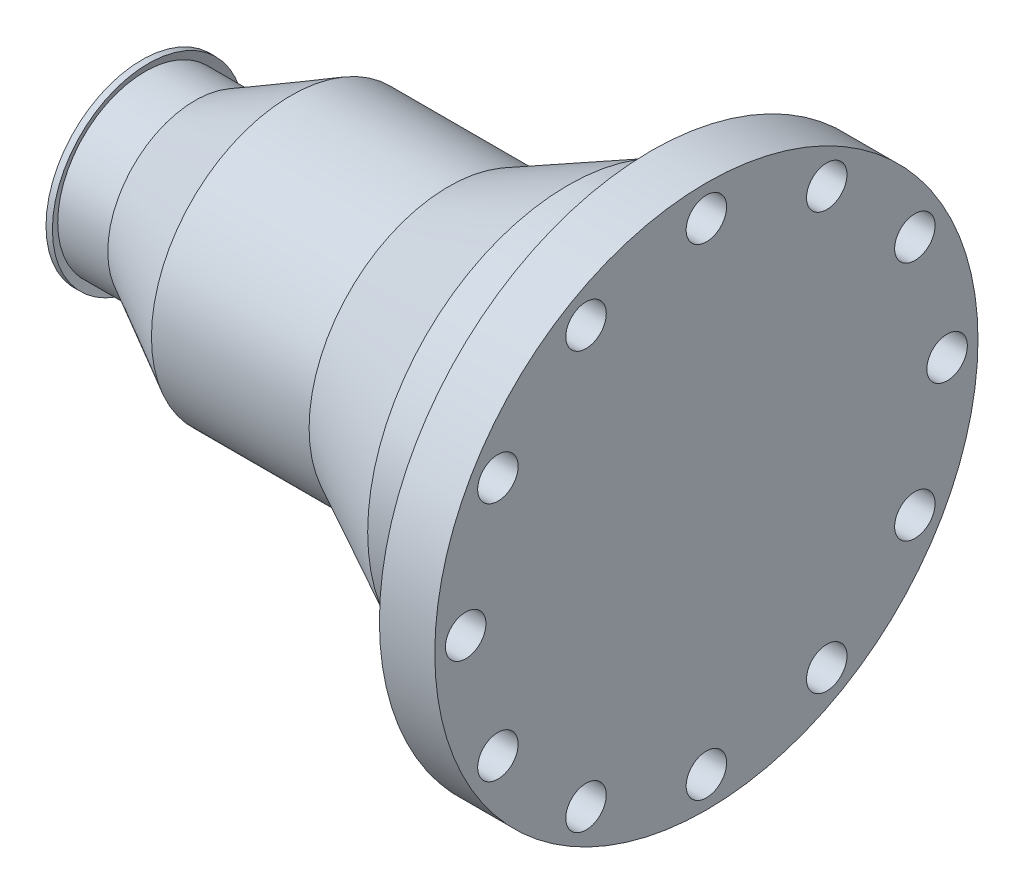
ISO-10303-21;
HEADER;
FILE_DESCRIPTION(('STEP AP214'),'2;1');
FILE_NAME('part.step','',(''),(''),'','','');
FILE_SCHEMA(('AUTOMOTIVE_DESIGN { 1 0 10303 214 1 1 1 1 }'));
ENDSEC;
DATA;
#1=APPLICATION_CONTEXT('core data for automotive mechanical design processes');
#2=APPLICATION_PROTOCOL_DEFINITION('international standard','automotive_design',2000,#1);
#3=PRODUCT_CONTEXT('',#1,'mechanical');
#4=PRODUCT('Part','Part','',(#3));
#5=PRODUCT_RELATED_PRODUCT_CATEGORY('part','',(#4));
#6=PRODUCT_DEFINITION_FORMATION('','',#4);
#7=PRODUCT_DEFINITION_CONTEXT('part definition',#1,'design');
#8=PRODUCT_DEFINITION('design','',#6,#7);
#9=PRODUCT_DEFINITION_SHAPE('','',#8);
#10=(LENGTH_UNIT() NAMED_UNIT(*) SI_UNIT(.MILLI.,.METRE.));
#11=(NAMED_UNIT(*) PLANE_ANGLE_UNIT() SI_UNIT($,.RADIAN.));
#12=(NAMED_UNIT(*) SI_UNIT($,.STERADIAN.) SOLID_ANGLE_UNIT());
#13=UNCERTAINTY_MEASURE_WITH_UNIT(LENGTH_MEASURE(1.E-05),#10,'distance_accuracy_value','');
#14=(GEOMETRIC_REPRESENTATION_CONTEXT(3) GLOBAL_UNCERTAINTY_ASSIGNED_CONTEXT((#13)) GLOBAL_UNIT_ASSIGNED_CONTEXT((#10,
#11,#12)) REPRESENTATION_CONTEXT('',''));
#15=CARTESIAN_POINT('',(0.,0.,0.));
#16=DIRECTION('',(0.,0.,1.));
#17=DIRECTION('',(1.,0.,0.));
#18=AXIS2_PLACEMENT_3D('',#15,#16,#17);
#19=CARTESIAN_POINT('',(0.,0.,0.));
#20=DIRECTION('',(1.,0.,0.));
#21=DIRECTION('',(0.,0.,-1.));
#22=AXIS2_PLACEMENT_3D('',#19,#20,#21);
#23=PLANE('',#22);
#24=CARTESIAN_POINT('',(0.,0.,0.));
#25=DIRECTION('',(-1.,0.,0.));
#26=DIRECTION('',(0.,0.,1.));
#27=AXIS2_PLACEMENT_3D('',#24,#25,#26);
#28=CIRCLE('',#27,31.);
#29=CARTESIAN_POINT('',(0.,0.,31.));
#30=VERTEX_POINT('',#29);
#31=EDGE_CURVE('E80',#30,#30,#28,.T.);
#32=ORIENTED_EDGE('',*,*,#31,.F.);
#33=EDGE_LOOP('',(#32));
#34=FACE_BOUND('',#33,.T.);
#35=CARTESIAN_POINT('',(0.,0.,0.));
#36=DIRECTION('',(-1.,0.,0.));
#37=DIRECTION('',(0.,0.,1.));
#38=AXIS2_PLACEMENT_3D('',#35,#36,#37);
#39=CIRCLE('',#38,45.);
#40=CARTESIAN_POINT('',(0.,0.,45.));
#41=VERTEX_POINT('',#40);
#42=EDGE_CURVE('E10',#41,#41,#39,.T.);
#43=ORIENTED_EDGE('',*,*,#42,.T.);
#44=EDGE_LOOP('',(#43));
#45=FACE_BOUND('',#44,.T.);
#46=ADVANCED_FACE('F37',(#34,#45),#23,.F.);
#47=CARTESIAN_POINT('',(0.,0.,0.));
#48=DIRECTION('',(-1.,0.,0.));
#49=DIRECTION('',(0.,0.,1.));
#50=AXIS2_PLACEMENT_3D('',#47,#48,#49);
#51=CYLINDRICAL_SURFACE('',#50,45.);
#52=ORIENTED_EDGE('',*,*,#42,.F.);
#53=EDGE_LOOP('',(#52));
#54=FACE_BOUND('',#53,.T.);
#55=CARTESIAN_POINT('',(3.,0.,0.));
#56=DIRECTION('',(-1.,0.,0.));
#57=DIRECTION('',(0.,0.,1.));
#58=AXIS2_PLACEMENT_3D('',#55,#56,#57);
#59=CIRCLE('',#58,45.);
#60=CARTESIAN_POINT('',(3.,0.,45.));
#61=VERTEX_POINT('',#60);
#62=EDGE_CURVE('E43',#61,#61,#59,.T.);
#63=ORIENTED_EDGE('',*,*,#62,.T.);
#64=EDGE_LOOP('',(#63));
#65=FACE_BOUND('',#64,.T.);
#66=ADVANCED_FACE('F205',(#54,#65),#51,.T.);
#67=CARTESIAN_POINT('',(1.5,0.,0.));
#68=DIRECTION('',(1.,0.,0.));
#69=DIRECTION('',(0.,0.,-1.));
#70=AXIS2_PLACEMENT_3D('',#67,#68,#69);
#71=CONICAL_SURFACE('',#70,41.,1.21202565652432);
#72=ORIENTED_EDGE('',*,*,#62,.F.);
#73=EDGE_LOOP('',(#72));
#74=FACE_BOUND('',#73,.T.);
#75=CARTESIAN_POINT('',(1.5,0.,0.));
#76=DIRECTION('',(-1.,0.,0.));
#77=DIRECTION('',(0.,0.,1.));
#78=AXIS2_PLACEMENT_3D('',#75,#76,#77);
#79=CIRCLE('',#78,41.);
#80=CARTESIAN_POINT('',(1.5,0.,41.));
#81=VERTEX_POINT('',#80);
#82=EDGE_CURVE('E47',#81,#81,#79,.T.);
#83=ORIENTED_EDGE('',*,*,#82,.T.);
#84=EDGE_LOOP('',(#83));
#85=FACE_BOUND('',#84,.T.);
#86=ADVANCED_FACE('F211',(#74,#85),#71,.F.);
#87=CARTESIAN_POINT('',(0.,0.,0.));
#88=DIRECTION('',(-1.,0.,0.));
#89=DIRECTION('',(0.,0.,1.));
#90=AXIS2_PLACEMENT_3D('',#87,#88,#89);
#91=CYLINDRICAL_SURFACE('',#90,41.);
#92=ORIENTED_EDGE('',*,*,#82,.F.);
#93=EDGE_LOOP('',(#92));
#94=FACE_BOUND('',#93,.T.);
#95=CARTESIAN_POINT('',(25.,0.,0.));
#96=DIRECTION('',(-1.,0.,0.));
#97=DIRECTION('',(0.,0.,1.));
#98=AXIS2_PLACEMENT_3D('',#95,#96,#97);
#99=CIRCLE('',#98,41.);
#100=CARTESIAN_POINT('',(25.,0.,41.));
#101=VERTEX_POINT('',#100);
#102=EDGE_CURVE('E51',#101,#101,#99,.T.);
#103=ORIENTED_EDGE('',*,*,#102,.T.);
#104=EDGE_LOOP('',(#103));
#105=FACE_BOUND('',#104,.T.);
#106=ADVANCED_FACE('F409',(#94,#105),#91,.T.);
#107=CARTESIAN_POINT('',(70.,0.,0.));
#108=DIRECTION('',(1.,0.,0.));
#109=DIRECTION('',(0.,0.,-1.));
#110=AXIS2_PLACEMENT_3D('',#107,#108,#109);
#111=CONICAL_SURFACE('',#110,65.5,0.498567905638218);
#112=ORIENTED_EDGE('',*,*,#102,.F.);
#113=EDGE_LOOP('',(#112));
#114=FACE_BOUND('',#113,.T.);
#115=CARTESIAN_POINT('',(70.,0.,0.));
#116=DIRECTION('',(-1.,0.,0.));
#117=DIRECTION('',(0.,0.,1.));
#118=AXIS2_PLACEMENT_3D('',#115,#116,#117);
#119=CIRCLE('',#118,65.5);
#120=CARTESIAN_POINT('',(70.,0.,65.5));
#121=VERTEX_POINT('',#120);
#122=EDGE_CURVE('E56',#121,#121,#119,.T.);
#123=ORIENTED_EDGE('',*,*,#122,.T.);
#124=EDGE_LOOP('',(#123));
#125=FACE_BOUND('',#124,.T.);
#126=ADVANCED_FACE('F400',(#114,#125),#111,.T.);
#127=CARTESIAN_POINT('',(0.,0.,0.));
#128=DIRECTION('',(-1.,0.,0.));
#129=DIRECTION('',(0.,0.,1.));
#130=AXIS2_PLACEMENT_3D('',#127,#128,#129);
#131=CYLINDRICAL_SURFACE('',#130,65.5);
#132=ORIENTED_EDGE('',*,*,#122,.F.);
#133=EDGE_LOOP('',(#132));
#134=FACE_BOUND('',#133,.T.);
#135=CARTESIAN_POINT('',(144.,0.,0.));
#136=DIRECTION('',(-1.,0.,0.));
#137=DIRECTION('',(0.,0.,1.));
#138=AXIS2_PLACEMENT_3D('',#135,#136,#137);
#139=CIRCLE('',#138,65.5);
#140=CARTESIAN_POINT('',(144.,0.,65.5));
#141=VERTEX_POINT('',#140);
#142=EDGE_CURVE('E59',#141,#141,#139,.T.);
#143=ORIENTED_EDGE('',*,*,#142,.T.);
#144=EDGE_LOOP('',(#143));
#145=FACE_BOUND('',#144,.T.);
#146=ADVANCED_FACE('F391',(#134,#145),#131,.T.);
#147=CARTESIAN_POINT('',(200.,0.,0.));
#148=DIRECTION('',(1.,0.,0.));
#149=DIRECTION('',(0.,0.,-1.));
#150=AXIS2_PLACEMENT_3D('',#147,#148,#149);
#151=CONICAL_SURFACE('',#150,94.,0.470764926542016);
#152=ORIENTED_EDGE('',*,*,#142,.F.);
#153=EDGE_LOOP('',(#152));
#154=FACE_BOUND('',#153,.T.);
#155=CARTESIAN_POINT('',(200.,0.,0.));
#156=DIRECTION('',(-1.,0.,0.));
#157=DIRECTION('',(0.,0.,1.));
#158=AXIS2_PLACEMENT_3D('',#155,#156,#157);
#159=CIRCLE('',#158,94.);
#160=CARTESIAN_POINT('',(200.,0.,94.));
#161=VERTEX_POINT('',#160);
#162=EDGE_CURVE('E62',#161,#161,#159,.T.);
#163=ORIENTED_EDGE('',*,*,#162,.T.);
#164=EDGE_LOOP('',(#163));
#165=FACE_BOUND('',#164,.T.);
#166=ADVANCED_FACE('F382',(#154,#165),#151,.T.);
#167=CARTESIAN_POINT('',(0.,0.,0.));
#168=DIRECTION('',(-1.,0.,0.));
#169=DIRECTION('',(0.,0.,1.));
#170=AXIS2_PLACEMENT_3D('',#167,#168,#169);
#171=CYLINDRICAL_SURFACE('',#170,94.);
#172=ORIENTED_EDGE('',*,*,#162,.F.);
#173=EDGE_LOOP('',(#172));
#174=FACE_BOUND('',#173,.T.);
#175=CARTESIAN_POINT('',(220.,0.,0.));
#176=DIRECTION('',(-1.,0.,0.));
#177=DIRECTION('',(0.,0.,1.));
#178=AXIS2_PLACEMENT_3D('',#175,#176,#177);
#179=CIRCLE('',#178,94.);
#180=CARTESIAN_POINT('',(220.,0.,94.));
#181=VERTEX_POINT('',#180);
#182=EDGE_CURVE('E65',#181,#181,#179,.T.);
#183=ORIENTED_EDGE('',*,*,#182,.T.);
#184=EDGE_LOOP('',(#183));
#185=FACE_BOUND('',#184,.T.);
#186=ADVANCED_FACE('F373',(#174,#185),#171,.T.);
#187=CARTESIAN_POINT('',(220.,94.,0.));
#188=DIRECTION('',(1.,0.,0.));
#189=DIRECTION('',(0.,0.,-1.));
#190=AXIS2_PLACEMENT_3D('',#187,#188,#189);
#191=PLANE('',#190);
#192=ORIENTED_EDGE('',*,*,#182,.F.);
#193=EDGE_LOOP('',(#192));
#194=FACE_BOUND('',#193,.T.);
#195=CARTESIAN_POINT('',(220.,0.,0.));
#196=DIRECTION('',(-1.,0.,0.));
#197=DIRECTION('',(0.,0.,1.));
#198=AXIS2_PLACEMENT_3D('',#195,#196,#197);
#199=CIRCLE('',#198,95.);
#200=CARTESIAN_POINT('',(220.,0.,95.));
#201=VERTEX_POINT('',#200);
#202=EDGE_CURVE('E68',#201,#201,#199,.T.);
#203=ORIENTED_EDGE('',*,*,#202,.T.);
#204=EDGE_LOOP('',(#203));
#205=FACE_BOUND('',#204,.T.);
#206=ADVANCED_FACE('F364',(#194,#205),#191,.F.);
#207=CARTESIAN_POINT('',(0.,0.,0.));
#208=DIRECTION('',(-1.,0.,0.));
#209=DIRECTION('',(0.,0.,1.));
#210=AXIS2_PLACEMENT_3D('',#207,#208,#209);
#211=CYLINDRICAL_SURFACE('',#210,95.);
#212=ORIENTED_EDGE('',*,*,#202,.F.);
#213=EDGE_LOOP('',(#212));
#214=FACE_BOUND('',#213,.T.);
#215=CARTESIAN_POINT('',(239.,0.,0.));
#216=DIRECTION('',(-1.,0.,0.));
#217=DIRECTION('',(0.,0.,1.));
#218=AXIS2_PLACEMENT_3D('',#215,#216,#217);
#219=CIRCLE('',#218,95.);
#220=CARTESIAN_POINT('',(239.,0.,95.));
#221=VERTEX_POINT('',#220);
#222=EDGE_CURVE('E71',#221,#221,#219,.T.);
#223=ORIENTED_EDGE('',*,*,#222,.T.);
#224=EDGE_LOOP('',(#223));
#225=FACE_BOUND('',#224,.T.);
#226=ADVANCED_FACE('F201',(#214,#225),#211,.T.);
#227=CARTESIAN_POINT('',(239.,100.,0.));
#228=DIRECTION('',(1.,0.,0.));
#229=DIRECTION('',(0.,0.,-1.));
#230=AXIS2_PLACEMENT_3D('',#227,#228,#229);
#231=PLANE('',#230);
#232=CARTESIAN_POINT('',(239.,97.8608706276416,-56.5));
#233=DIRECTION('',(1.,0.,0.));
#234=DIRECTION('',(0.,0.,-1.));
#235=AXIS2_PLACEMENT_3D('',#232,#233,#234);
#236=CIRCLE('',#235,9.50000000000001);
#237=CARTESIAN_POINT('',(239.,97.8608706276416,-66.));
#238=VERTEX_POINT('',#237);
#239=EDGE_CURVE('E152',#238,#238,#236,.F.);
#240=ORIENTED_EDGE('',*,*,#239,.F.);
#241=EDGE_LOOP('',(#240));
#242=FACE_BOUND('',#241,.T.);
#243=CARTESIAN_POINT('',(239.,56.4999999999999,-97.8608706276416));
#244=DIRECTION('',(1.,0.,0.));
#245=DIRECTION('',(0.,0.,-1.));
#246=AXIS2_PLACEMENT_3D('',#243,#244,#245);
#247=CIRCLE('',#246,9.5);
#248=CARTESIAN_POINT('',(239.,56.4999999999999,-107.360870627642));
#249=VERTEX_POINT('',#248);
#250=EDGE_CURVE('E146',#249,#249,#247,.F.);
#251=ORIENTED_EDGE('',*,*,#250,.F.);
#252=EDGE_LOOP('',(#251));
#253=FACE_BOUND('',#252,.T.);
#254=CARTESIAN_POINT('',(239.,0.,-113.));
#255=DIRECTION('',(1.,0.,0.));
#256=DIRECTION('',(0.,0.,-1.));
#257=AXIS2_PLACEMENT_3D('',#254,#255,#256);
#258=CIRCLE('',#257,9.49999999999999);
#259=CARTESIAN_POINT('',(239.,0.,-122.5));
#260=VERTEX_POINT('',#259);
#261=EDGE_CURVE('E140',#260,#260,#258,.F.);
#262=ORIENTED_EDGE('',*,*,#261,.F.);
#263=EDGE_LOOP('',(#262));
#264=FACE_BOUND('',#263,.T.);
#265=CARTESIAN_POINT('',(239.,-56.5,-97.8608706276415));
#266=DIRECTION('',(1.,0.,0.));
#267=DIRECTION('',(0.,0.,-1.));
#268=AXIS2_PLACEMENT_3D('',#265,#266,#267);
#269=CIRCLE('',#268,9.5);
#270=CARTESIAN_POINT('',(239.,-56.5,-107.360870627642));
#271=VERTEX_POINT('',#270);
#272=EDGE_CURVE('E134',#271,#271,#269,.F.);
#273=ORIENTED_EDGE('',*,*,#272,.F.);
#274=EDGE_LOOP('',(#273));
#275=FACE_BOUND('',#274,.T.);
#276=CARTESIAN_POINT('',(239.,-97.8608706276416,-56.5));
#277=DIRECTION('',(1.,0.,0.));
#278=DIRECTION('',(0.,0.,-1.));
#279=AXIS2_PLACEMENT_3D('',#276,#277,#278);
#280=CIRCLE('',#279,9.50000000000001);
#281=CARTESIAN_POINT('',(239.,-97.8608706276416,-66.));
#282=VERTEX_POINT('',#281);
#283=EDGE_CURVE('E128',#282,#282,#280,.F.);
#284=ORIENTED_EDGE('',*,*,#283,.F.);
#285=EDGE_LOOP('',(#284));
#286=FACE_BOUND('',#285,.T.);
#287=CARTESIAN_POINT('',(239.,-113.,0.));
#288=DIRECTION('',(1.,0.,0.));
#289=DIRECTION('',(0.,0.,-1.));
#290=AXIS2_PLACEMENT_3D('',#287,#288,#289);
#291=CIRCLE('',#290,9.49999999999998);
#292=CARTESIAN_POINT('',(239.,-113.,-9.49999999999998));
#293=VERTEX_POINT('',#292);
#294=EDGE_CURVE('E122',#293,#293,#291,.F.);
#295=ORIENTED_EDGE('',*,*,#294,.F.);
#296=EDGE_LOOP('',(#295));
#297=FACE_BOUND('',#296,.T.);
#298=CARTESIAN_POINT('',(239.,-97.8608706276415,56.5));
#299=DIRECTION('',(1.,0.,0.));
#300=DIRECTION('',(0.,0.,-1.));
#301=AXIS2_PLACEMENT_3D('',#298,#299,#300);
#302=CIRCLE('',#301,9.5);
#303=CARTESIAN_POINT('',(239.,-97.8608706276415,47.));
#304=VERTEX_POINT('',#303);
#305=EDGE_CURVE('E116',#304,#304,#302,.F.);
#306=ORIENTED_EDGE('',*,*,#305,.F.);
#307=EDGE_LOOP('',(#306));
#308=FACE_BOUND('',#307,.T.);
#309=CARTESIAN_POINT('',(239.,-56.5,97.8608706276416));
#310=DIRECTION('',(1.,0.,0.));
#311=DIRECTION('',(0.,0.,-1.));
#312=AXIS2_PLACEMENT_3D('',#309,#310,#311);
#313=CIRCLE('',#312,9.5);
#314=CARTESIAN_POINT('',(239.,-56.5,88.3608706276416));
#315=VERTEX_POINT('',#314);
#316=EDGE_CURVE('E110',#315,#315,#313,.F.);
#317=ORIENTED_EDGE('',*,*,#316,.F.);
#318=EDGE_LOOP('',(#317));
#319=FACE_BOUND('',#318,.T.);
#320=CARTESIAN_POINT('',(239.,0.,113.));
#321=DIRECTION('',(1.,0.,0.));
#322=DIRECTION('',(0.,0.,-1.));
#323=AXIS2_PLACEMENT_3D('',#320,#321,#322);
#324=CIRCLE('',#323,9.49999999999999);
#325=CARTESIAN_POINT('',(239.,0.,103.5));
#326=VERTEX_POINT('',#325);
#327=EDGE_CURVE('E104',#326,#326,#324,.F.);
#328=ORIENTED_EDGE('',*,*,#327,.F.);
#329=EDGE_LOOP('',(#328));
#330=FACE_BOUND('',#329,.T.);
#331=CARTESIAN_POINT('',(239.,56.5,97.8608706276416));
#332=DIRECTION('',(1.,0.,0.));
#333=DIRECTION('',(0.,0.,-1.));
#334=AXIS2_PLACEMENT_3D('',#331,#332,#333);
#335=CIRCLE('',#334,9.5);
#336=CARTESIAN_POINT('',(239.,56.5,88.3608706276416));
#337=VERTEX_POINT('',#336);
#338=EDGE_CURVE('E98',#337,#337,#335,.F.);
#339=ORIENTED_EDGE('',*,*,#338,.F.);
#340=EDGE_LOOP('',(#339));
#341=FACE_BOUND('',#340,.T.);
#342=CARTESIAN_POINT('',(239.,97.8608706276416,56.5));
#343=DIRECTION('',(1.,0.,0.));
#344=DIRECTION('',(0.,0.,-1.));
#345=AXIS2_PLACEMENT_3D('',#342,#343,#344);
#346=CIRCLE('',#345,9.5);
#347=CARTESIAN_POINT('',(239.,97.8608706276416,47.));
#348=VERTEX_POINT('',#347);
#349=EDGE_CURVE('E92',#348,#348,#346,.F.);
#350=ORIENTED_EDGE('',*,*,#349,.F.);
#351=EDGE_LOOP('',(#350));
#352=FACE_BOUND('',#351,.T.);
#353=CARTESIAN_POINT('',(239.,113.,0.));
#354=DIRECTION('',(1.,0.,0.));
#355=DIRECTION('',(0.,0.,-1.));
#356=AXIS2_PLACEMENT_3D('',#353,#354,#355);
#357=CIRCLE('',#356,9.50000000000001);
#358=CARTESIAN_POINT('',(239.,113.,-9.50000000000001));
#359=VERTEX_POINT('',#358);
#360=EDGE_CURVE('E86',#359,#359,#357,.F.);
#361=ORIENTED_EDGE('',*,*,#360,.F.);
#362=EDGE_LOOP('',(#361));
#363=FACE_BOUND('',#362,.T.);
#364=ORIENTED_EDGE('',*,*,#222,.F.);
#365=EDGE_LOOP('',(#364));
#366=FACE_BOUND('',#365,.T.);
#367=CARTESIAN_POINT('',(239.,0.,0.));
#368=DIRECTION('',(-1.,0.,0.));
#369=DIRECTION('',(0.,0.,1.));
#370=AXIS2_PLACEMENT_3D('',#367,#368,#369);
#371=CIRCLE('',#370,127.5);
#372=CARTESIAN_POINT('',(239.,0.,127.5));
#373=VERTEX_POINT('',#372);
#374=EDGE_CURVE('E74',#373,#373,#371,.T.);
#375=ORIENTED_EDGE('',*,*,#374,.T.);
#376=EDGE_LOOP('',(#375));
#377=FACE_BOUND('',#376,.T.);
#378=ADVANCED_FACE('F193',(#242,#253,#264,#275,#286,#297,#308,#319,#330,#341,#352,#363,#366,
#377),#231,.F.);
#379=CARTESIAN_POINT('',(0.,0.,0.));
#380=DIRECTION('',(-1.,0.,0.));
#381=DIRECTION('',(0.,0.,1.));
#382=AXIS2_PLACEMENT_3D('',#379,#380,#381);
#383=CYLINDRICAL_SURFACE('',#382,127.5);
#384=ORIENTED_EDGE('',*,*,#374,.F.);
#385=EDGE_LOOP('',(#384));
#386=FACE_BOUND('',#385,.T.);
#387=CARTESIAN_POINT('',(265.,0.,0.));
#388=DIRECTION('',(-1.,0.,0.));
#389=DIRECTION('',(0.,0.,1.));
#390=AXIS2_PLACEMENT_3D('',#387,#388,#389);
#391=CIRCLE('',#390,127.5);
#392=CARTESIAN_POINT('',(265.,0.,127.5));
#393=VERTEX_POINT('',#392);
#394=EDGE_CURVE('E77',#393,#393,#391,.T.);
#395=ORIENTED_EDGE('',*,*,#394,.T.);
#396=EDGE_LOOP('',(#395));
#397=FACE_BOUND('',#396,.T.);
#398=ADVANCED_FACE('F166',(#386,#397),#383,.T.);
#399=CARTESIAN_POINT('',(265.,127.5,0.));
#400=DIRECTION('',(-1.,0.,0.));
#401=DIRECTION('',(0.,0.,1.));
#402=AXIS2_PLACEMENT_3D('',#399,#400,#401);
#403=PLANE('',#402);
#404=CARTESIAN_POINT('',(265.,97.8608706276416,-56.5));
#405=DIRECTION('',(1.,0.,0.));
#406=DIRECTION('',(0.,0.,-1.));
#407=AXIS2_PLACEMENT_3D('',#404,#405,#406);
#408=CIRCLE('',#407,9.50000000000001);
#409=CARTESIAN_POINT('',(265.,97.8608706276416,-66.));
#410=VERTEX_POINT('',#409);
#411=EDGE_CURVE('E155',#410,#410,#408,.T.);
#412=ORIENTED_EDGE('',*,*,#411,.F.);
#413=EDGE_LOOP('',(#412));
#414=FACE_BOUND('',#413,.T.);
#415=CARTESIAN_POINT('',(265.,56.4999999999999,-97.8608706276416));
#416=DIRECTION('',(1.,0.,0.));
#417=DIRECTION('',(0.,0.,-1.));
#418=AXIS2_PLACEMENT_3D('',#415,#416,#417);
#419=CIRCLE('',#418,9.5);
#420=CARTESIAN_POINT('',(265.,56.4999999999999,-107.360870627642));
#421=VERTEX_POINT('',#420);
#422=EDGE_CURVE('E149',#421,#421,#419,.T.);
#423=ORIENTED_EDGE('',*,*,#422,.F.);
#424=EDGE_LOOP('',(#423));
#425=FACE_BOUND('',#424,.T.);
#426=CARTESIAN_POINT('',(265.,0.,-113.));
#427=DIRECTION('',(1.,0.,0.));
#428=DIRECTION('',(0.,0.,-1.));
#429=AXIS2_PLACEMENT_3D('',#426,#427,#428);
#430=CIRCLE('',#429,9.49999999999999);
#431=CARTESIAN_POINT('',(265.,0.,-122.5));
#432=VERTEX_POINT('',#431);
#433=EDGE_CURVE('E143',#432,#432,#430,.T.);
#434=ORIENTED_EDGE('',*,*,#433,.F.);
#435=EDGE_LOOP('',(#434));
#436=FACE_BOUND('',#435,.T.);
#437=CARTESIAN_POINT('',(265.,-56.5,-97.8608706276415));
#438=DIRECTION('',(1.,0.,0.));
#439=DIRECTION('',(0.,0.,-1.));
#440=AXIS2_PLACEMENT_3D('',#437,#438,#439);
#441=CIRCLE('',#440,9.5);
#442=CARTESIAN_POINT('',(265.,-56.5,-107.360870627642));
#443=VERTEX_POINT('',#442);
#444=EDGE_CURVE('E137',#443,#443,#441,.T.);
#445=ORIENTED_EDGE('',*,*,#444,.F.);
#446=EDGE_LOOP('',(#445));
#447=FACE_BOUND('',#446,.T.);
#448=CARTESIAN_POINT('',(265.,-97.8608706276416,-56.5));
#449=DIRECTION('',(1.,0.,0.));
#450=DIRECTION('',(0.,0.,-1.));
#451=AXIS2_PLACEMENT_3D('',#448,#449,#450);
#452=CIRCLE('',#451,9.50000000000001);
#453=CARTESIAN_POINT('',(265.,-97.8608706276416,-66.));
#454=VERTEX_POINT('',#453);
#455=EDGE_CURVE('E131',#454,#454,#452,.T.);
#456=ORIENTED_EDGE('',*,*,#455,.F.);
#457=EDGE_LOOP('',(#456));
#458=FACE_BOUND('',#457,.T.);
#459=CARTESIAN_POINT('',(265.,-113.,0.));
#460=DIRECTION('',(1.,0.,0.));
#461=DIRECTION('',(0.,0.,-1.));
#462=AXIS2_PLACEMENT_3D('',#459,#460,#461);
#463=CIRCLE('',#462,9.49999999999998);
#464=CARTESIAN_POINT('',(265.,-113.,-9.49999999999998));
#465=VERTEX_POINT('',#464);
#466=EDGE_CURVE('E125',#465,#465,#463,.T.);
#467=ORIENTED_EDGE('',*,*,#466,.F.);
#468=EDGE_LOOP('',(#467));
#469=FACE_BOUND('',#468,.T.);
#470=CARTESIAN_POINT('',(265.,-97.8608706276415,56.5));
#471=DIRECTION('',(1.,0.,0.));
#472=DIRECTION('',(0.,0.,-1.));
#473=AXIS2_PLACEMENT_3D('',#470,#471,#472);
#474=CIRCLE('',#473,9.5);
#475=CARTESIAN_POINT('',(265.,-97.8608706276415,47.));
#476=VERTEX_POINT('',#475);
#477=EDGE_CURVE('E119',#476,#476,#474,.T.);
#478=ORIENTED_EDGE('',*,*,#477,.F.);
#479=EDGE_LOOP('',(#478));
#480=FACE_BOUND('',#479,.T.);
#481=CARTESIAN_POINT('',(265.,-56.5,97.8608706276416));
#482=DIRECTION('',(1.,0.,0.));
#483=DIRECTION('',(0.,0.,-1.));
#484=AXIS2_PLACEMENT_3D('',#481,#482,#483);
#485=CIRCLE('',#484,9.5);
#486=CARTESIAN_POINT('',(265.,-56.5,88.3608706276416));
#487=VERTEX_POINT('',#486);
#488=EDGE_CURVE('E113',#487,#487,#485,.T.);
#489=ORIENTED_EDGE('',*,*,#488,.F.);
#490=EDGE_LOOP('',(#489));
#491=FACE_BOUND('',#490,.T.);
#492=CARTESIAN_POINT('',(265.,0.,113.));
#493=DIRECTION('',(1.,0.,0.));
#494=DIRECTION('',(0.,0.,-1.));
#495=AXIS2_PLACEMENT_3D('',#492,#493,#494);
#496=CIRCLE('',#495,9.49999999999999);
#497=CARTESIAN_POINT('',(265.,0.,103.5));
#498=VERTEX_POINT('',#497);
#499=EDGE_CURVE('E107',#498,#498,#496,.T.);
#500=ORIENTED_EDGE('',*,*,#499,.F.);
#501=EDGE_LOOP('',(#500));
#502=FACE_BOUND('',#501,.T.);
#503=CARTESIAN_POINT('',(265.,56.5,97.8608706276416));
#504=DIRECTION('',(1.,0.,0.));
#505=DIRECTION('',(0.,0.,-1.));
#506=AXIS2_PLACEMENT_3D('',#503,#504,#505);
#507=CIRCLE('',#506,9.5);
#508=CARTESIAN_POINT('',(265.,56.5,88.3608706276416));
#509=VERTEX_POINT('',#508);
#510=EDGE_CURVE('E101',#509,#509,#507,.T.);
#511=ORIENTED_EDGE('',*,*,#510,.F.);
#512=EDGE_LOOP('',(#511));
#513=FACE_BOUND('',#512,.T.);
#514=CARTESIAN_POINT('',(265.,97.8608706276416,56.5));
#515=DIRECTION('',(1.,0.,0.));
#516=DIRECTION('',(0.,0.,-1.));
#517=AXIS2_PLACEMENT_3D('',#514,#515,#516);
#518=CIRCLE('',#517,9.5);
#519=CARTESIAN_POINT('',(265.,97.8608706276416,47.));
#520=VERTEX_POINT('',#519);
#521=EDGE_CURVE('E95',#520,#520,#518,.T.);
#522=ORIENTED_EDGE('',*,*,#521,.F.);
#523=EDGE_LOOP('',(#522));
#524=FACE_BOUND('',#523,.T.);
#525=CARTESIAN_POINT('',(265.,113.,0.));
#526=DIRECTION('',(1.,0.,0.));
#527=DIRECTION('',(0.,0.,-1.));
#528=AXIS2_PLACEMENT_3D('',#525,#526,#527);
#529=CIRCLE('',#528,9.50000000000001);
#530=CARTESIAN_POINT('',(265.,113.,-9.50000000000001));
#531=VERTEX_POINT('',#530);
#532=EDGE_CURVE('E89',#531,#531,#529,.T.);
#533=ORIENTED_EDGE('',*,*,#532,.F.);
#534=EDGE_LOOP('',(#533));
#535=FACE_BOUND('',#534,.T.);
#536=ORIENTED_EDGE('',*,*,#394,.F.);
#537=EDGE_LOOP('',(#536));
#538=FACE_BOUND('',#537,.T.);
#539=ADVANCED_FACE('F162',(#414,#425,#436,#447,#458,#469,#480,#491,#502,#513,#524,#535,#538),
#403,.F.);
#540=CARTESIAN_POINT('',(0.,0.,0.));
#541=DIRECTION('',(-1.,0.,0.));
#542=DIRECTION('',(0.,0.,1.));
#543=AXIS2_PLACEMENT_3D('',#540,#541,#542);
#544=CYLINDRICAL_SURFACE('',#543,31.);
#545=ORIENTED_EDGE('',*,*,#31,.T.);
#546=EDGE_LOOP('',(#545));
#547=FACE_BOUND('',#546,.T.);
#548=CARTESIAN_POINT('',(38.,0.,0.));
#549=DIRECTION('',(-1.,0.,0.));
#550=DIRECTION('',(0.,0.,1.));
#551=AXIS2_PLACEMENT_3D('',#548,#549,#550);
#552=CIRCLE('',#551,31.);
#553=CARTESIAN_POINT('',(38.,0.,31.));
#554=VERTEX_POINT('',#553);
#555=EDGE_CURVE('E83',#554,#554,#552,.T.);
#556=ORIENTED_EDGE('',*,*,#555,.F.);
#557=EDGE_LOOP('',(#556));
#558=FACE_BOUND('',#557,.T.);
#559=ADVANCED_FACE('F165',(#547,#558),#544,.F.);
#560=CARTESIAN_POINT('',(38.,31.,0.));
#561=DIRECTION('',(-1.,0.,0.));
#562=DIRECTION('',(0.,0.,1.));
#563=AXIS2_PLACEMENT_3D('',#560,#561,#562);
#564=PLANE('',#563);
#565=ORIENTED_EDGE('',*,*,#555,.T.);
#566=EDGE_LOOP('',(#565));
#567=FACE_BOUND('',#566,.T.);
#568=ADVANCED_FACE('F216',(#567),#564,.T.);
#569=CARTESIAN_POINT('',(265.,113.,0.));
#570=DIRECTION('',(-1.,0.,0.));
#571=DIRECTION('',(0.,0.,1.));
#572=AXIS2_PLACEMENT_3D('',#569,#570,#571);
#573=CYLINDRICAL_SURFACE('',#572,9.50000000000001);
#574=ORIENTED_EDGE('',*,*,#532,.T.);
#575=EDGE_LOOP('',(#574));
#576=FACE_BOUND('',#575,.T.);
#577=ORIENTED_EDGE('',*,*,#360,.T.);
#578=EDGE_LOOP('',(#577));
#579=FACE_BOUND('',#578,.T.);
#580=ADVANCED_FACE('F221',(#576,#579),#573,.F.);
#581=CARTESIAN_POINT('',(265.,97.8608706276416,56.5));
#582=DIRECTION('',(-1.,0.,0.));
#583=DIRECTION('',(0.,0.,1.));
#584=AXIS2_PLACEMENT_3D('',#581,#582,#583);
#585=CYLINDRICAL_SURFACE('',#584,9.5);
#586=ORIENTED_EDGE('',*,*,#521,.T.);
#587=EDGE_LOOP('',(#586));
#588=FACE_BOUND('',#587,.T.);
#589=ORIENTED_EDGE('',*,*,#349,.T.);
#590=EDGE_LOOP('',(#589));
#591=FACE_BOUND('',#590,.T.);
#592=ADVANCED_FACE('F226',(#588,#591),#585,.F.);
#593=CARTESIAN_POINT('',(265.,56.5,97.8608706276416));
#594=DIRECTION('',(-1.,0.,0.));
#595=DIRECTION('',(0.,0.,1.));
#596=AXIS2_PLACEMENT_3D('',#593,#594,#595);
#597=CYLINDRICAL_SURFACE('',#596,9.5);
#598=ORIENTED_EDGE('',*,*,#510,.T.);
#599=EDGE_LOOP('',(#598));
#600=FACE_BOUND('',#599,.T.);
#601=ORIENTED_EDGE('',*,*,#338,.T.);
#602=EDGE_LOOP('',(#601));
#603=FACE_BOUND('',#602,.T.);
#604=ADVANCED_FACE('F232',(#600,#603),#597,.F.);
#605=CARTESIAN_POINT('',(265.,0.,113.));
#606=DIRECTION('',(-1.,0.,0.));
#607=DIRECTION('',(0.,0.,1.));
#608=AXIS2_PLACEMENT_3D('',#605,#606,#607);
#609=CYLINDRICAL_SURFACE('',#608,9.49999999999999);
#610=ORIENTED_EDGE('',*,*,#499,.T.);
#611=EDGE_LOOP('',(#610));
#612=FACE_BOUND('',#611,.T.);
#613=ORIENTED_EDGE('',*,*,#327,.T.);
#614=EDGE_LOOP('',(#613));
#615=FACE_BOUND('',#614,.T.);
#616=ADVANCED_FACE('F236',(#612,#615),#609,.F.);
#617=CARTESIAN_POINT('',(265.,-56.5,97.8608706276416));
#618=DIRECTION('',(-1.,0.,0.));
#619=DIRECTION('',(0.,0.,1.));
#620=AXIS2_PLACEMENT_3D('',#617,#618,#619);
#621=CYLINDRICAL_SURFACE('',#620,9.5);
#622=ORIENTED_EDGE('',*,*,#488,.T.);
#623=EDGE_LOOP('',(#622));
#624=FACE_BOUND('',#623,.T.);
#625=ORIENTED_EDGE('',*,*,#316,.T.);
#626=EDGE_LOOP('',(#625));
#627=FACE_BOUND('',#626,.T.);
#628=ADVANCED_FACE('F240',(#624,#627),#621,.F.);
#629=CARTESIAN_POINT('',(265.,-97.8608706276415,56.5));
#630=DIRECTION('',(-1.,0.,0.));
#631=DIRECTION('',(0.,0.,1.));
#632=AXIS2_PLACEMENT_3D('',#629,#630,#631);
#633=CYLINDRICAL_SURFACE('',#632,9.5);
#634=ORIENTED_EDGE('',*,*,#477,.T.);
#635=EDGE_LOOP('',(#634));
#636=FACE_BOUND('',#635,.T.);
#637=ORIENTED_EDGE('',*,*,#305,.T.);
#638=EDGE_LOOP('',(#637));
#639=FACE_BOUND('',#638,.T.);
#640=ADVANCED_FACE('F244',(#636,#639),#633,.F.);
#641=CARTESIAN_POINT('',(265.,-113.,0.));
#642=DIRECTION('',(-1.,0.,0.));
#643=DIRECTION('',(0.,0.,1.));
#644=AXIS2_PLACEMENT_3D('',#641,#642,#643);
#645=CYLINDRICAL_SURFACE('',#644,9.49999999999998);
#646=ORIENTED_EDGE('',*,*,#466,.T.);
#647=EDGE_LOOP('',(#646));
#648=FACE_BOUND('',#647,.T.);
#649=ORIENTED_EDGE('',*,*,#294,.T.);
#650=EDGE_LOOP('',(#649));
#651=FACE_BOUND('',#650,.T.);
#652=ADVANCED_FACE('F248',(#648,#651),#645,.F.);
#653=CARTESIAN_POINT('',(265.,-97.8608706276416,-56.5));
#654=DIRECTION('',(-1.,0.,0.));
#655=DIRECTION('',(0.,0.,1.));
#656=AXIS2_PLACEMENT_3D('',#653,#654,#655);
#657=CYLINDRICAL_SURFACE('',#656,9.50000000000001);
#658=ORIENTED_EDGE('',*,*,#455,.T.);
#659=EDGE_LOOP('',(#658));
#660=FACE_BOUND('',#659,.T.);
#661=ORIENTED_EDGE('',*,*,#283,.T.);
#662=EDGE_LOOP('',(#661));
#663=FACE_BOUND('',#662,.T.);
#664=ADVANCED_FACE('F252',(#660,#663),#657,.F.);
#665=CARTESIAN_POINT('',(265.,-56.5,-97.8608706276415));
#666=DIRECTION('',(-1.,0.,0.));
#667=DIRECTION('',(0.,0.,1.));
#668=AXIS2_PLACEMENT_3D('',#665,#666,#667);
#669=CYLINDRICAL_SURFACE('',#668,9.5);
#670=ORIENTED_EDGE('',*,*,#444,.T.);
#671=EDGE_LOOP('',(#670));
#672=FACE_BOUND('',#671,.T.);
#673=ORIENTED_EDGE('',*,*,#272,.T.);
#674=EDGE_LOOP('',(#673));
#675=FACE_BOUND('',#674,.T.);
#676=ADVANCED_FACE('F256',(#672,#675),#669,.F.);
#677=CARTESIAN_POINT('',(265.,0.,-113.));
#678=DIRECTION('',(-1.,0.,0.));
#679=DIRECTION('',(0.,0.,1.));
#680=AXIS2_PLACEMENT_3D('',#677,#678,#679);
#681=CYLINDRICAL_SURFACE('',#680,9.49999999999999);
#682=ORIENTED_EDGE('',*,*,#433,.T.);
#683=EDGE_LOOP('',(#682));
#684=FACE_BOUND('',#683,.T.);
#685=ORIENTED_EDGE('',*,*,#261,.T.);
#686=EDGE_LOOP('',(#685));
#687=FACE_BOUND('',#686,.T.);
#688=ADVANCED_FACE('F260',(#684,#687),#681,.F.);
#689=CARTESIAN_POINT('',(265.,56.4999999999999,-97.8608706276416));
#690=DIRECTION('',(-1.,0.,0.));
#691=DIRECTION('',(0.,0.,1.));
#692=AXIS2_PLACEMENT_3D('',#689,#690,#691);
#693=CYLINDRICAL_SURFACE('',#692,9.5);
#694=ORIENTED_EDGE('',*,*,#422,.T.);
#695=EDGE_LOOP('',(#694));
#696=FACE_BOUND('',#695,.T.);
#697=ORIENTED_EDGE('',*,*,#250,.T.);
#698=EDGE_LOOP('',(#697));
#699=FACE_BOUND('',#698,.T.);
#700=ADVANCED_FACE('F264',(#696,#699),#693,.F.);
#701=CARTESIAN_POINT('',(265.,97.8608706276416,-56.5));
#702=DIRECTION('',(-1.,0.,0.));
#703=DIRECTION('',(0.,0.,1.));
#704=AXIS2_PLACEMENT_3D('',#701,#702,#703);
#705=CYLINDRICAL_SURFACE('',#704,9.50000000000001);
#706=ORIENTED_EDGE('',*,*,#411,.T.);
#707=EDGE_LOOP('',(#706));
#708=FACE_BOUND('',#707,.T.);
#709=ORIENTED_EDGE('',*,*,#239,.T.);
#710=EDGE_LOOP('',(#709));
#711=FACE_BOUND('',#710,.T.);
#712=ADVANCED_FACE('F159',(#708,#711),#705,.F.);
#713=CLOSED_SHELL('',(#46,#66,#86,#106,#126,#146,#166,#186,#206,#226,#378,#398,#539,#559,#568,
#580,#592,#604,#616,#628,#640,#652,#664,#676,#688,#700,#712));
#714=MANIFOLD_SOLID_BREP('B2',#713);
#715=ADVANCED_BREP_SHAPE_REPRESENTATION('',(#18,#714),#14);
#716=SHAPE_DEFINITION_REPRESENTATION(#9,#715);
ENDSEC;
END-ISO-10303-21;
